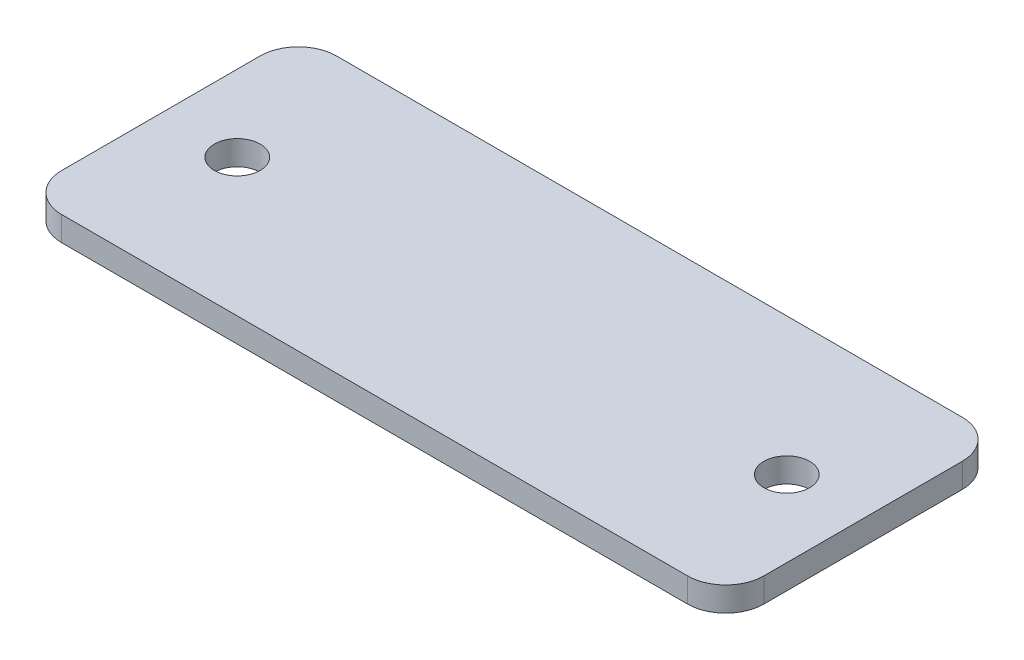
ISO-10303-21;
HEADER;
FILE_DESCRIPTION(('STEP AP214'),'2;1');
FILE_NAME('part.step','',(''),(''),'','','');
FILE_SCHEMA(('AUTOMOTIVE_DESIGN { 1 0 10303 214 1 1 1 1 }'));
ENDSEC;
DATA;
#1=APPLICATION_CONTEXT('core data for automotive mechanical design processes');
#2=APPLICATION_PROTOCOL_DEFINITION('international standard','automotive_design',2000,#1);
#3=PRODUCT_CONTEXT('',#1,'mechanical');
#4=PRODUCT('Part','Part','',(#3));
#5=PRODUCT_RELATED_PRODUCT_CATEGORY('part','',(#4));
#6=PRODUCT_DEFINITION_FORMATION('','',#4);
#7=PRODUCT_DEFINITION_CONTEXT('part definition',#1,'design');
#8=PRODUCT_DEFINITION('design','',#6,#7);
#9=PRODUCT_DEFINITION_SHAPE('','',#8);
#10=(LENGTH_UNIT() NAMED_UNIT(*) SI_UNIT(.MILLI.,.METRE.));
#11=(NAMED_UNIT(*) PLANE_ANGLE_UNIT() SI_UNIT($,.RADIAN.));
#12=(NAMED_UNIT(*) SI_UNIT($,.STERADIAN.) SOLID_ANGLE_UNIT());
#13=UNCERTAINTY_MEASURE_WITH_UNIT(LENGTH_MEASURE(1.E-05),#10,'distance_accuracy_value','');
#14=(GEOMETRIC_REPRESENTATION_CONTEXT(3) GLOBAL_UNCERTAINTY_ASSIGNED_CONTEXT((#13)) GLOBAL_UNIT_ASSIGNED_CONTEXT((#10,
#11,#12)) REPRESENTATION_CONTEXT('',''));
#15=CARTESIAN_POINT('',(0.,0.,0.));
#16=DIRECTION('',(0.,0.,1.));
#17=DIRECTION('',(1.,0.,0.));
#18=AXIS2_PLACEMENT_3D('',#15,#16,#17);
#19=CARTESIAN_POINT('',(0.,1.6,0.));
#20=DIRECTION('',(0.,-1.,0.));
#21=DIRECTION('',(0.,0.,-1.));
#22=AXIS2_PLACEMENT_3D('',#19,#20,#21);
#23=PLANE('',#22);
#24=DIRECTION('',(-1.,0.,0.));
#25=VECTOR('',#24,1.);
#26=CARTESIAN_POINT('',(-23.,1.6,-9.));
#27=LINE('',#26,#25);
#28=CARTESIAN_POINT('',(20.5,1.6,-9.));
#29=VERTEX_POINT('',#28);
#30=CARTESIAN_POINT('',(-20.5,1.6,-9.));
#31=VERTEX_POINT('',#30);
#32=EDGE_CURVE('E176',#29,#31,#27,.T.);
#33=ORIENTED_EDGE('',*,*,#32,.T.);
#34=CARTESIAN_POINT('',(-20.5,1.6,-6.5));
#35=DIRECTION('',(0.,-1.,0.));
#36=DIRECTION('',(0.,0.,-1.));
#37=AXIS2_PLACEMENT_3D('',#34,#35,#36);
#38=CIRCLE('',#37,2.5);
#39=CARTESIAN_POINT('',(-23.,1.6,-6.5));
#40=VERTEX_POINT('',#39);
#41=EDGE_CURVE('E157',#31,#40,#38,.F.);
#42=ORIENTED_EDGE('',*,*,#41,.T.);
#43=DIRECTION('',(0.,0.,1.));
#44=VECTOR('',#43,1.);
#45=CARTESIAN_POINT('',(-23.,1.6,9.));
#46=LINE('',#45,#44);
#47=CARTESIAN_POINT('',(-23.,1.6,6.5));
#48=VERTEX_POINT('',#47);
#49=EDGE_CURVE('E127',#40,#48,#46,.T.);
#50=ORIENTED_EDGE('',*,*,#49,.T.);
#51=CARTESIAN_POINT('',(-20.5,1.6,6.5));
#52=DIRECTION('',(0.,-1.,0.));
#53=DIRECTION('',(0.,0.,-1.));
#54=AXIS2_PLACEMENT_3D('',#51,#52,#53);
#55=CIRCLE('',#54,2.5);
#56=CARTESIAN_POINT('',(-20.5,1.6,9.));
#57=VERTEX_POINT('',#56);
#58=EDGE_CURVE('E63',#48,#57,#55,.F.);
#59=ORIENTED_EDGE('',*,*,#58,.T.);
#60=DIRECTION('',(1.,0.,0.));
#61=VECTOR('',#60,1.);
#62=CARTESIAN_POINT('',(-23.,1.6,9.));
#63=LINE('',#62,#61);
#64=CARTESIAN_POINT('',(20.5,1.6,9.));
#65=VERTEX_POINT('',#64);
#66=EDGE_CURVE('E143',#57,#65,#63,.T.);
#67=ORIENTED_EDGE('',*,*,#66,.T.);
#68=CARTESIAN_POINT('',(20.5,1.6,6.5));
#69=DIRECTION('',(0.,-1.,0.));
#70=DIRECTION('',(0.,0.,-1.));
#71=AXIS2_PLACEMENT_3D('',#68,#69,#70);
#72=CIRCLE('',#71,2.5);
#73=CARTESIAN_POINT('',(23.,1.6,6.5));
#74=VERTEX_POINT('',#73);
#75=EDGE_CURVE('E154',#65,#74,#72,.F.);
#76=ORIENTED_EDGE('',*,*,#75,.T.);
#77=DIRECTION('',(0.,0.,-1.));
#78=VECTOR('',#77,1.);
#79=CARTESIAN_POINT('',(23.,1.6,9.));
#80=LINE('',#79,#78);
#81=CARTESIAN_POINT('',(23.,1.6,-6.5));
#82=VERTEX_POINT('',#81);
#83=EDGE_CURVE('E137',#74,#82,#80,.T.);
#84=ORIENTED_EDGE('',*,*,#83,.T.);
#85=CARTESIAN_POINT('',(20.5,1.6,-6.5));
#86=DIRECTION('',(0.,-1.,0.));
#87=DIRECTION('',(0.,0.,-1.));
#88=AXIS2_PLACEMENT_3D('',#85,#86,#87);
#89=CIRCLE('',#88,2.5);
#90=EDGE_CURVE('E152',#82,#29,#89,.F.);
#91=ORIENTED_EDGE('',*,*,#90,.T.);
#92=EDGE_LOOP('',(#33,#42,#50,#59,#67,#76,#84,#91));
#93=FACE_BOUND('',#92,.T.);
#94=CARTESIAN_POINT('',(-18.,1.6,0.));
#95=DIRECTION('',(0.,1.,0.));
#96=DIRECTION('',(0.,0.,1.));
#97=AXIS2_PLACEMENT_3D('',#94,#95,#96);
#98=CIRCLE('',#97,1.5);
#99=CARTESIAN_POINT('',(-18.,1.6,1.5));
#100=VERTEX_POINT('',#99);
#101=EDGE_CURVE('E181',#100,#100,#98,.T.);
#102=ORIENTED_EDGE('',*,*,#101,.F.);
#103=EDGE_LOOP('',(#102));
#104=FACE_BOUND('',#103,.T.);
#105=CARTESIAN_POINT('',(18.,1.6,0.));
#106=DIRECTION('',(0.,1.,0.));
#107=DIRECTION('',(0.,0.,1.));
#108=AXIS2_PLACEMENT_3D('',#105,#106,#107);
#109=CIRCLE('',#108,1.5);
#110=CARTESIAN_POINT('',(18.,1.6,1.5));
#111=VERTEX_POINT('',#110);
#112=EDGE_CURVE('E190',#111,#111,#109,.T.);
#113=ORIENTED_EDGE('',*,*,#112,.F.);
#114=EDGE_LOOP('',(#113));
#115=FACE_BOUND('',#114,.T.);
#116=ADVANCED_FACE('F41',(#93,#104,#115),#23,.F.);
#117=CARTESIAN_POINT('',(0.,0.,0.));
#118=DIRECTION('',(0.,-1.,0.));
#119=DIRECTION('',(0.,0.,-1.));
#120=AXIS2_PLACEMENT_3D('',#117,#118,#119);
#121=PLANE('',#120);
#122=CARTESIAN_POINT('',(-18.,0.,0.));
#123=DIRECTION('',(0.,1.,0.));
#124=DIRECTION('',(0.,0.,1.));
#125=AXIS2_PLACEMENT_3D('',#122,#123,#124);
#126=CIRCLE('',#125,1.5);
#127=CARTESIAN_POINT('',(-18.,0.,1.5));
#128=VERTEX_POINT('',#127);
#129=EDGE_CURVE('E183',#128,#128,#126,.T.);
#130=ORIENTED_EDGE('',*,*,#129,.T.);
#131=EDGE_LOOP('',(#130));
#132=FACE_BOUND('',#131,.T.);
#133=DIRECTION('',(0.,0.,1.));
#134=VECTOR('',#133,1.);
#135=CARTESIAN_POINT('',(-23.,0.,9.));
#136=LINE('',#135,#134);
#137=CARTESIAN_POINT('',(-23.,0.,-6.5));
#138=VERTEX_POINT('',#137);
#139=CARTESIAN_POINT('',(-23.,0.,6.5));
#140=VERTEX_POINT('',#139);
#141=EDGE_CURVE('E125',#138,#140,#136,.T.);
#142=ORIENTED_EDGE('',*,*,#141,.F.);
#143=CARTESIAN_POINT('',(-20.5,0.,-6.5));
#144=DIRECTION('',(0.,-1.,0.));
#145=DIRECTION('',(0.,0.,-1.));
#146=AXIS2_PLACEMENT_3D('',#143,#144,#145);
#147=CIRCLE('',#146,2.5);
#148=CARTESIAN_POINT('',(-20.5,0.,-9.));
#149=VERTEX_POINT('',#148);
#150=EDGE_CURVE('E108',#138,#149,#147,.T.);
#151=ORIENTED_EDGE('',*,*,#150,.T.);
#152=DIRECTION('',(-1.,0.,0.));
#153=VECTOR('',#152,1.);
#154=CARTESIAN_POINT('',(-23.,0.,-9.));
#155=LINE('',#154,#153);
#156=CARTESIAN_POINT('',(20.5,0.,-9.));
#157=VERTEX_POINT('',#156);
#158=EDGE_CURVE('E135',#157,#149,#155,.T.);
#159=ORIENTED_EDGE('',*,*,#158,.F.);
#160=CARTESIAN_POINT('',(20.5,0.,-6.5));
#161=DIRECTION('',(0.,-1.,0.));
#162=DIRECTION('',(0.,0.,-1.));
#163=AXIS2_PLACEMENT_3D('',#160,#161,#162);
#164=CIRCLE('',#163,2.5);
#165=CARTESIAN_POINT('',(23.,0.,-6.5));
#166=VERTEX_POINT('',#165);
#167=EDGE_CURVE('E128',#157,#166,#164,.T.);
#168=ORIENTED_EDGE('',*,*,#167,.T.);
#169=DIRECTION('',(0.,0.,-1.));
#170=VECTOR('',#169,1.);
#171=CARTESIAN_POINT('',(23.,0.,9.));
#172=LINE('',#171,#170);
#173=CARTESIAN_POINT('',(23.,0.,6.5));
#174=VERTEX_POINT('',#173);
#175=EDGE_CURVE('E139',#174,#166,#172,.T.);
#176=ORIENTED_EDGE('',*,*,#175,.F.);
#177=CARTESIAN_POINT('',(20.5,0.,6.5));
#178=DIRECTION('',(0.,-1.,0.));
#179=DIRECTION('',(0.,0.,-1.));
#180=AXIS2_PLACEMENT_3D('',#177,#178,#179);
#181=CIRCLE('',#180,2.5);
#182=CARTESIAN_POINT('',(20.5,0.,9.));
#183=VERTEX_POINT('',#182);
#184=EDGE_CURVE('E146',#174,#183,#181,.T.);
#185=ORIENTED_EDGE('',*,*,#184,.T.);
#186=DIRECTION('',(1.,0.,0.));
#187=VECTOR('',#186,1.);
#188=CARTESIAN_POINT('',(-23.,0.,9.));
#189=LINE('',#188,#187);
#190=CARTESIAN_POINT('',(-20.5,0.,9.));
#191=VERTEX_POINT('',#190);
#192=EDGE_CURVE('E134',#191,#183,#189,.T.);
#193=ORIENTED_EDGE('',*,*,#192,.F.);
#194=CARTESIAN_POINT('',(-20.5,0.,6.5));
#195=DIRECTION('',(0.,-1.,0.));
#196=DIRECTION('',(0.,0.,-1.));
#197=AXIS2_PLACEMENT_3D('',#194,#195,#196);
#198=CIRCLE('',#197,2.5);
#199=EDGE_CURVE('E119',#191,#140,#198,.T.);
#200=ORIENTED_EDGE('',*,*,#199,.T.);
#201=EDGE_LOOP('',(#142,#151,#159,#168,#176,#185,#193,#200));
#202=FACE_BOUND('',#201,.T.);
#203=CARTESIAN_POINT('',(18.,0.,0.));
#204=DIRECTION('',(0.,1.,0.));
#205=DIRECTION('',(0.,0.,1.));
#206=AXIS2_PLACEMENT_3D('',#203,#204,#205);
#207=CIRCLE('',#206,1.5);
#208=CARTESIAN_POINT('',(18.,0.,1.5));
#209=VERTEX_POINT('',#208);
#210=EDGE_CURVE('E192',#209,#209,#207,.T.);
#211=ORIENTED_EDGE('',*,*,#210,.T.);
#212=EDGE_LOOP('',(#211));
#213=FACE_BOUND('',#212,.T.);
#214=ADVANCED_FACE('F131',(#132,#202,#213),#121,.T.);
#215=CARTESIAN_POINT('',(23.,1.6,9.));
#216=DIRECTION('',(-1.,0.,0.));
#217=DIRECTION('',(0.,0.,1.));
#218=AXIS2_PLACEMENT_3D('',#215,#216,#217);
#219=PLANE('',#218);
#220=ORIENTED_EDGE('',*,*,#83,.F.);
#221=DIRECTION('',(0.,-1.,0.));
#222=VECTOR('',#221,1.);
#223=CARTESIAN_POINT('',(23.,1.6,6.5));
#224=LINE('',#223,#222);
#225=EDGE_CURVE('E11',#74,#174,#224,.T.);
#226=ORIENTED_EDGE('',*,*,#225,.T.);
#227=ORIENTED_EDGE('',*,*,#175,.T.);
#228=DIRECTION('',(0.,-1.,0.));
#229=VECTOR('',#228,1.);
#230=CARTESIAN_POINT('',(23.,1.6,-6.5));
#231=LINE('',#230,#229);
#232=EDGE_CURVE('E49',#166,#82,#231,.F.);
#233=ORIENTED_EDGE('',*,*,#232,.T.);
#234=EDGE_LOOP('',(#220,#226,#227,#233));
#235=FACE_BOUND('',#234,.T.);
#236=ADVANCED_FACE('F167',(#235),#219,.F.);
#237=CARTESIAN_POINT('',(-23.,1.6,-9.));
#238=DIRECTION('',(0.,0.,1.));
#239=DIRECTION('',(1.,0.,0.));
#240=AXIS2_PLACEMENT_3D('',#237,#238,#239);
#241=PLANE('',#240);
#242=ORIENTED_EDGE('',*,*,#158,.T.);
#243=DIRECTION('',(0.,-1.,0.));
#244=VECTOR('',#243,1.);
#245=CARTESIAN_POINT('',(-20.5,1.6,-9.));
#246=LINE('',#245,#244);
#247=EDGE_CURVE('E113',#149,#31,#246,.F.);
#248=ORIENTED_EDGE('',*,*,#247,.T.);
#249=ORIENTED_EDGE('',*,*,#32,.F.);
#250=DIRECTION('',(0.,-1.,0.));
#251=VECTOR('',#250,1.);
#252=CARTESIAN_POINT('',(20.5,1.6,-9.));
#253=LINE('',#252,#251);
#254=EDGE_CURVE('E118',#29,#157,#253,.T.);
#255=ORIENTED_EDGE('',*,*,#254,.T.);
#256=EDGE_LOOP('',(#242,#248,#249,#255));
#257=FACE_BOUND('',#256,.T.);
#258=ADVANCED_FACE('F180',(#257),#241,.F.);
#259=CARTESIAN_POINT('',(-23.,1.6,9.));
#260=DIRECTION('',(1.,0.,0.));
#261=DIRECTION('',(0.,0.,-1.));
#262=AXIS2_PLACEMENT_3D('',#259,#260,#261);
#263=PLANE('',#262);
#264=ORIENTED_EDGE('',*,*,#49,.F.);
#265=DIRECTION('',(0.,-1.,0.));
#266=VECTOR('',#265,1.);
#267=CARTESIAN_POINT('',(-23.,1.6,-6.5));
#268=LINE('',#267,#266);
#269=EDGE_CURVE('E112',#40,#138,#268,.T.);
#270=ORIENTED_EDGE('',*,*,#269,.T.);
#271=ORIENTED_EDGE('',*,*,#141,.T.);
#272=DIRECTION('',(0.,-1.,0.));
#273=VECTOR('',#272,1.);
#274=CARTESIAN_POINT('',(-23.,1.6,6.5));
#275=LINE('',#274,#273);
#276=EDGE_CURVE('E129',#140,#48,#275,.F.);
#277=ORIENTED_EDGE('',*,*,#276,.T.);
#278=EDGE_LOOP('',(#264,#270,#271,#277));
#279=FACE_BOUND('',#278,.T.);
#280=ADVANCED_FACE('F124',(#279),#263,.F.);
#281=CARTESIAN_POINT('',(-23.,1.6,9.));
#282=DIRECTION('',(0.,0.,-1.));
#283=DIRECTION('',(-1.,0.,0.));
#284=AXIS2_PLACEMENT_3D('',#281,#282,#283);
#285=PLANE('',#284);
#286=ORIENTED_EDGE('',*,*,#66,.F.);
#287=DIRECTION('',(0.,-1.,0.));
#288=VECTOR('',#287,1.);
#289=CARTESIAN_POINT('',(-20.5,1.6,9.));
#290=LINE('',#289,#288);
#291=EDGE_CURVE('E160',#57,#191,#290,.T.);
#292=ORIENTED_EDGE('',*,*,#291,.T.);
#293=ORIENTED_EDGE('',*,*,#192,.T.);
#294=DIRECTION('',(0.,-1.,0.));
#295=VECTOR('',#294,1.);
#296=CARTESIAN_POINT('',(20.5,1.6,9.));
#297=LINE('',#296,#295);
#298=EDGE_CURVE('E56',#183,#65,#297,.F.);
#299=ORIENTED_EDGE('',*,*,#298,.T.);
#300=EDGE_LOOP('',(#286,#292,#293,#299));
#301=FACE_BOUND('',#300,.T.);
#302=ADVANCED_FACE('F212',(#301),#285,.F.);
#303=CARTESIAN_POINT('',(-18.,1.6,0.));
#304=DIRECTION('',(0.,-1.,0.));
#305=DIRECTION('',(0.,0.,-1.));
#306=AXIS2_PLACEMENT_3D('',#303,#304,#305);
#307=CYLINDRICAL_SURFACE('',#306,1.5);
#308=ORIENTED_EDGE('',*,*,#101,.T.);
#309=EDGE_LOOP('',(#308));
#310=FACE_BOUND('',#309,.T.);
#311=ORIENTED_EDGE('',*,*,#129,.F.);
#312=EDGE_LOOP('',(#311));
#313=FACE_BOUND('',#312,.T.);
#314=ADVANCED_FACE('F209',(#310,#313),#307,.F.);
#315=CARTESIAN_POINT('',(18.,1.6,0.));
#316=DIRECTION('',(0.,-1.,0.));
#317=DIRECTION('',(0.,0.,-1.));
#318=AXIS2_PLACEMENT_3D('',#315,#316,#317);
#319=CYLINDRICAL_SURFACE('',#318,1.5);
#320=ORIENTED_EDGE('',*,*,#112,.T.);
#321=EDGE_LOOP('',(#320));
#322=FACE_BOUND('',#321,.T.);
#323=ORIENTED_EDGE('',*,*,#210,.F.);
#324=EDGE_LOOP('',(#323));
#325=FACE_BOUND('',#324,.T.);
#326=ADVANCED_FACE('F198',(#322,#325),#319,.F.);
#327=CARTESIAN_POINT('',(-20.5,1.6,-6.5));
#328=DIRECTION('',(0.,-1.,0.));
#329=DIRECTION('',(0.,0.,-1.));
#330=AXIS2_PLACEMENT_3D('',#327,#328,#329);
#331=CYLINDRICAL_SURFACE('',#330,2.5);
#332=ORIENTED_EDGE('',*,*,#41,.F.);
#333=ORIENTED_EDGE('',*,*,#247,.F.);
#334=ORIENTED_EDGE('',*,*,#150,.F.);
#335=ORIENTED_EDGE('',*,*,#269,.F.);
#336=EDGE_LOOP('',(#332,#333,#334,#335));
#337=FACE_BOUND('',#336,.T.);
#338=ADVANCED_FACE('F111',(#337),#331,.T.);
#339=CARTESIAN_POINT('',(-20.5,1.6,6.5));
#340=DIRECTION('',(0.,-1.,0.));
#341=DIRECTION('',(0.,0.,-1.));
#342=AXIS2_PLACEMENT_3D('',#339,#340,#341);
#343=CYLINDRICAL_SURFACE('',#342,2.5);
#344=ORIENTED_EDGE('',*,*,#58,.F.);
#345=ORIENTED_EDGE('',*,*,#276,.F.);
#346=ORIENTED_EDGE('',*,*,#199,.F.);
#347=ORIENTED_EDGE('',*,*,#291,.F.);
#348=EDGE_LOOP('',(#344,#345,#346,#347));
#349=FACE_BOUND('',#348,.T.);
#350=ADVANCED_FACE('F223',(#349),#343,.T.);
#351=CARTESIAN_POINT('',(20.5,1.6,6.5));
#352=DIRECTION('',(0.,-1.,0.));
#353=DIRECTION('',(0.,0.,-1.));
#354=AXIS2_PLACEMENT_3D('',#351,#352,#353);
#355=CYLINDRICAL_SURFACE('',#354,2.5);
#356=ORIENTED_EDGE('',*,*,#75,.F.);
#357=ORIENTED_EDGE('',*,*,#298,.F.);
#358=ORIENTED_EDGE('',*,*,#184,.F.);
#359=ORIENTED_EDGE('',*,*,#225,.F.);
#360=EDGE_LOOP('',(#356,#357,#358,#359));
#361=FACE_BOUND('',#360,.T.);
#362=ADVANCED_FACE('F225',(#361),#355,.T.);
#363=CARTESIAN_POINT('',(20.5,1.6,-6.5));
#364=DIRECTION('',(0.,-1.,0.));
#365=DIRECTION('',(0.,0.,-1.));
#366=AXIS2_PLACEMENT_3D('',#363,#364,#365);
#367=CYLINDRICAL_SURFACE('',#366,2.5);
#368=ORIENTED_EDGE('',*,*,#90,.F.);
#369=ORIENTED_EDGE('',*,*,#232,.F.);
#370=ORIENTED_EDGE('',*,*,#167,.F.);
#371=ORIENTED_EDGE('',*,*,#254,.F.);
#372=EDGE_LOOP('',(#368,#369,#370,#371));
#373=FACE_BOUND('',#372,.T.);
#374=ADVANCED_FACE('F43',(#373),#367,.T.);
#375=CLOSED_SHELL('',(#116,#214,#236,#258,#280,#302,#314,#326,#338,#350,#362,#374));
#376=MANIFOLD_SOLID_BREP('B2',#375);
#377=ADVANCED_BREP_SHAPE_REPRESENTATION('',(#18,#376),#14);
#378=SHAPE_DEFINITION_REPRESENTATION(#9,#377);
ENDSEC;
END-ISO-10303-21;
